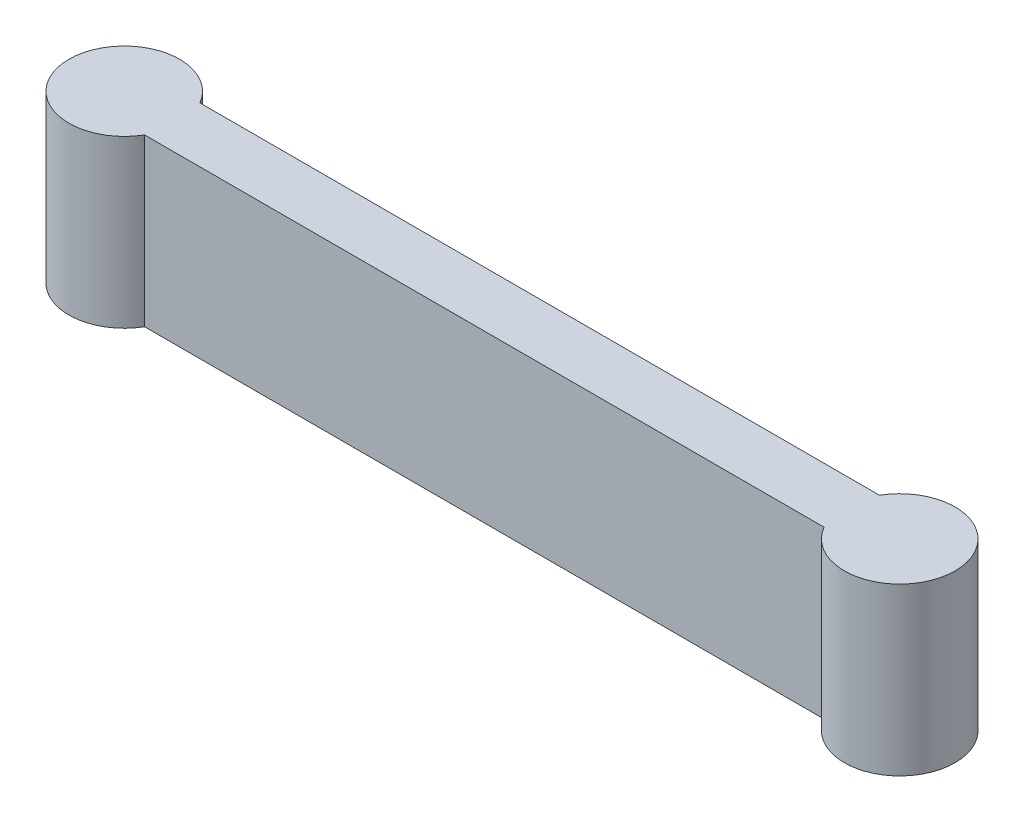
ISO-10303-21;
HEADER;
FILE_DESCRIPTION(('STEP AP214'),'2;1');
FILE_NAME('part.step','',(''),(''),'','','');
FILE_SCHEMA(('AUTOMOTIVE_DESIGN { 1 0 10303 214 1 1 1 1 }'));
ENDSEC;
DATA;
#1=APPLICATION_CONTEXT('core data for automotive mechanical design processes');
#2=APPLICATION_PROTOCOL_DEFINITION('international standard','automotive_design',2000,#1);
#3=PRODUCT_CONTEXT('',#1,'mechanical');
#4=PRODUCT('Part','Part','',(#3));
#5=PRODUCT_RELATED_PRODUCT_CATEGORY('part','',(#4));
#6=PRODUCT_DEFINITION_FORMATION('','',#4);
#7=PRODUCT_DEFINITION_CONTEXT('part definition',#1,'design');
#8=PRODUCT_DEFINITION('design','',#6,#7);
#9=PRODUCT_DEFINITION_SHAPE('','',#8);
#10=(LENGTH_UNIT() NAMED_UNIT(*) SI_UNIT(.MILLI.,.METRE.));
#11=(NAMED_UNIT(*) PLANE_ANGLE_UNIT() SI_UNIT($,.RADIAN.));
#12=(NAMED_UNIT(*) SI_UNIT($,.STERADIAN.) SOLID_ANGLE_UNIT());
#13=UNCERTAINTY_MEASURE_WITH_UNIT(LENGTH_MEASURE(1.E-05),#10,'distance_accuracy_value','');
#14=(GEOMETRIC_REPRESENTATION_CONTEXT(3) GLOBAL_UNCERTAINTY_ASSIGNED_CONTEXT((#13)) GLOBAL_UNIT_ASSIGNED_CONTEXT((#10,
#11,#12)) REPRESENTATION_CONTEXT('',''));
#15=CARTESIAN_POINT('',(0.,0.,0.));
#16=DIRECTION('',(0.,0.,1.));
#17=DIRECTION('',(1.,0.,0.));
#18=AXIS2_PLACEMENT_3D('',#15,#16,#17);
#19=CARTESIAN_POINT('',(0.,881.22577482986,0.));
#20=DIRECTION('',(0.,-1.,0.));
#21=DIRECTION('',(0.,0.,-1.));
#22=AXIS2_PLACEMENT_3D('',#19,#20,#21);
#23=CYLINDRICAL_SURFACE('',#22,50.);
#24=CARTESIAN_POINT('',(0.,74.9999999999998,0.));
#25=DIRECTION('',(0.,1.,0.));
#26=DIRECTION('',(-1.,0.,0.));
#27=AXIS2_PLACEMENT_3D('',#24,#25,#26);
#28=CIRCLE('',#27,50.);
#29=CARTESIAN_POINT('',(43.3012701892219,75.0000000000004,-25.));
#30=VERTEX_POINT('',#29);
#31=CARTESIAN_POINT('',(43.3012701892219,75.0000000000051,25.));
#32=VERTEX_POINT('',#31);
#33=EDGE_CURVE('E99',#30,#32,#28,.T.);
#34=ORIENTED_EDGE('',*,*,#33,.F.);
#35=DIRECTION('',(0.,-1.,0.));
#36=VECTOR('',#35,1.);
#37=CARTESIAN_POINT('',(43.3012701892219,881.22577482986,-25.));
#38=LINE('',#37,#36);
#39=CARTESIAN_POINT('',(43.3012701892219,-74.9999999999996,-25.));
#40=VERTEX_POINT('',#39);
#41=EDGE_CURVE('E37',#30,#40,#38,.T.);
#42=ORIENTED_EDGE('',*,*,#41,.T.);
#43=CARTESIAN_POINT('',(0.,-75.0000000000002,0.));
#44=DIRECTION('',(0.,1.,0.));
#45=DIRECTION('',(-1.,0.,0.));
#46=AXIS2_PLACEMENT_3D('',#43,#44,#45);
#47=CIRCLE('',#46,50.);
#48=CARTESIAN_POINT('',(43.3012701892219,-74.9999999999994,25.));
#49=VERTEX_POINT('',#48);
#50=EDGE_CURVE('E93',#49,#40,#47,.F.);
#51=ORIENTED_EDGE('',*,*,#50,.F.);
#52=DIRECTION('',(0.,-1.,0.));
#53=VECTOR('',#52,1.);
#54=CARTESIAN_POINT('',(43.3012701892219,881.22577482986,25.));
#55=LINE('',#54,#53);
#56=EDGE_CURVE('E82',#32,#49,#55,.T.);
#57=ORIENTED_EDGE('',*,*,#56,.F.);
#58=EDGE_LOOP('',(#34,#42,#51,#57));
#59=FACE_BOUND('',#58,.T.);
#60=ADVANCED_FACE('F33',(#59),#23,.T.);
#61=CARTESIAN_POINT('',(43.3012701892219,881.22577482986,25.));
#62=DIRECTION('',(0.,0.,-1.));
#63=DIRECTION('',(-1.,0.,0.));
#64=AXIS2_PLACEMENT_3D('',#61,#62,#63);
#65=PLANE('',#64);
#66=DIRECTION('',(1.,0.,0.));
#67=VECTOR('',#66,1.);
#68=CARTESIAN_POINT('',(43.3012701892336,75.0000000000006,25.));
#69=LINE('',#68,#67);
#70=CARTESIAN_POINT('',(656.698729810778,75.0000000000093,24.9999999999998));
#71=VERTEX_POINT('',#70);
#72=EDGE_CURVE('E42',#32,#71,#69,.T.);
#73=ORIENTED_EDGE('',*,*,#72,.F.);
#74=ORIENTED_EDGE('',*,*,#56,.T.);
#75=DIRECTION('',(-1.,0.,0.));
#76=VECTOR('',#75,1.);
#77=CARTESIAN_POINT('',(43.3012701892102,-74.9999999999994,25.));
#78=LINE('',#77,#76);
#79=CARTESIAN_POINT('',(656.698729810778,-74.9999999999952,24.9999999999998));
#80=VERTEX_POINT('',#79);
#81=EDGE_CURVE('E88',#80,#49,#78,.T.);
#82=ORIENTED_EDGE('',*,*,#81,.F.);
#83=DIRECTION('',(0.,-1.,0.));
#84=VECTOR('',#83,1.);
#85=CARTESIAN_POINT('',(656.698729810778,881.22577482986,24.9999999999998));
#86=LINE('',#85,#84);
#87=EDGE_CURVE('E77',#71,#80,#86,.T.);
#88=ORIENTED_EDGE('',*,*,#87,.F.);
#89=EDGE_LOOP('',(#73,#74,#82,#88));
#90=FACE_BOUND('',#89,.T.);
#91=ADVANCED_FACE('F92',(#90),#65,.F.);
#92=CARTESIAN_POINT('',(700.,881.22577482986,0.));
#93=DIRECTION('',(0.,-1.,0.));
#94=DIRECTION('',(0.,0.,-1.));
#95=AXIS2_PLACEMENT_3D('',#92,#93,#94);
#96=CYLINDRICAL_SURFACE('',#95,49.9999999999999);
#97=CARTESIAN_POINT('',(700.,75.0000000000101,0.));
#98=DIRECTION('',(0.,1.,0.));
#99=DIRECTION('',(-1.,0.,0.));
#100=AXIS2_PLACEMENT_3D('',#97,#98,#99);
#101=CIRCLE('',#100,49.9999999999999);
#102=CARTESIAN_POINT('',(656.698729810778,75.0000000000048,-24.9999999999999));
#103=VERTEX_POINT('',#102);
#104=EDGE_CURVE('E11',#71,#103,#101,.T.);
#105=ORIENTED_EDGE('',*,*,#104,.F.);
#106=ORIENTED_EDGE('',*,*,#87,.T.);
#107=CARTESIAN_POINT('',(700.,-74.99999999999,0.));
#108=DIRECTION('',(0.,1.,0.));
#109=DIRECTION('',(-1.,0.,0.));
#110=AXIS2_PLACEMENT_3D('',#107,#108,#109);
#111=CIRCLE('',#110,49.9999999999999);
#112=CARTESIAN_POINT('',(656.698729810778,-74.9999999999907,-24.9999999999999));
#113=VERTEX_POINT('',#112);
#114=EDGE_CURVE('E80',#113,#80,#111,.F.);
#115=ORIENTED_EDGE('',*,*,#114,.F.);
#116=DIRECTION('',(0.,-1.,0.));
#117=VECTOR('',#116,1.);
#118=CARTESIAN_POINT('',(656.698729810778,881.22577482986,-24.9999999999999));
#119=LINE('',#118,#117);
#120=EDGE_CURVE('E58',#103,#113,#119,.T.);
#121=ORIENTED_EDGE('',*,*,#120,.F.);
#122=EDGE_LOOP('',(#105,#106,#115,#121));
#123=FACE_BOUND('',#122,.T.);
#124=ADVANCED_FACE('F79',(#123),#96,.T.);
#125=CARTESIAN_POINT('',(656.698729810778,881.22577482986,-24.9999999999999));
#126=DIRECTION('',(0.,0.,1.));
#127=DIRECTION('',(1.,0.,0.));
#128=AXIS2_PLACEMENT_3D('',#125,#126,#127);
#129=PLANE('',#128);
#130=DIRECTION('',(-1.,0.,0.));
#131=VECTOR('',#130,1.);
#132=CARTESIAN_POINT('',(656.69872981079,75.0000000000093,-24.9999999999999));
#133=LINE('',#132,#131);
#134=EDGE_CURVE('E102',#103,#30,#133,.T.);
#135=ORIENTED_EDGE('',*,*,#134,.F.);
#136=ORIENTED_EDGE('',*,*,#120,.T.);
#137=DIRECTION('',(1.,0.,0.));
#138=VECTOR('',#137,1.);
#139=CARTESIAN_POINT('',(656.698729810766,-74.9999999999907,-24.9999999999999));
#140=LINE('',#139,#138);
#141=EDGE_CURVE('E90',#40,#113,#140,.T.);
#142=ORIENTED_EDGE('',*,*,#141,.F.);
#143=ORIENTED_EDGE('',*,*,#41,.F.);
#144=EDGE_LOOP('',(#135,#136,#142,#143));
#145=FACE_BOUND('',#144,.T.);
#146=ADVANCED_FACE('F106',(#145),#129,.F.);
#147=CARTESIAN_POINT('',(-3.88578058618805E-13,74.9999999999998,4.44089209850063E-13));
#148=DIRECTION('',(0.,1.,0.));
#149=DIRECTION('',(-0.173648177666914,0.,0.984807753012211));
#150=AXIS2_PLACEMENT_3D('',#147,#148,#149);
#151=PLANE('',#150);
#152=ORIENTED_EDGE('',*,*,#134,.T.);
#153=ORIENTED_EDGE('',*,*,#33,.T.);
#154=ORIENTED_EDGE('',*,*,#72,.T.);
#155=ORIENTED_EDGE('',*,*,#104,.T.);
#156=EDGE_LOOP('',(#152,#153,#154,#155));
#157=FACE_BOUND('',#156,.T.);
#158=ADVANCED_FACE('F35',(#157),#151,.T.);
#159=CARTESIAN_POINT('',(1.77635683940025E-12,-75.0000000000002,8.88178419700125E-13));
#160=DIRECTION('',(0.,1.,0.));
#161=DIRECTION('',(-0.173648177666914,0.,0.984807753012211));
#162=AXIS2_PLACEMENT_3D('',#159,#160,#161);
#163=PLANE('',#162);
#164=ORIENTED_EDGE('',*,*,#50,.T.);
#165=ORIENTED_EDGE('',*,*,#141,.T.);
#166=ORIENTED_EDGE('',*,*,#114,.T.);
#167=ORIENTED_EDGE('',*,*,#81,.T.);
#168=EDGE_LOOP('',(#164,#165,#166,#167));
#169=FACE_BOUND('',#168,.T.);
#170=ADVANCED_FACE('F87',(#169),#163,.F.);
#171=CLOSED_SHELL('',(#60,#91,#124,#146,#158,#170));
#172=MANIFOLD_SOLID_BREP('B2',#171);
#173=ADVANCED_BREP_SHAPE_REPRESENTATION('',(#18,#172),#14);
#174=SHAPE_DEFINITION_REPRESENTATION(#9,#173);
ENDSEC;
END-ISO-10303-21;
